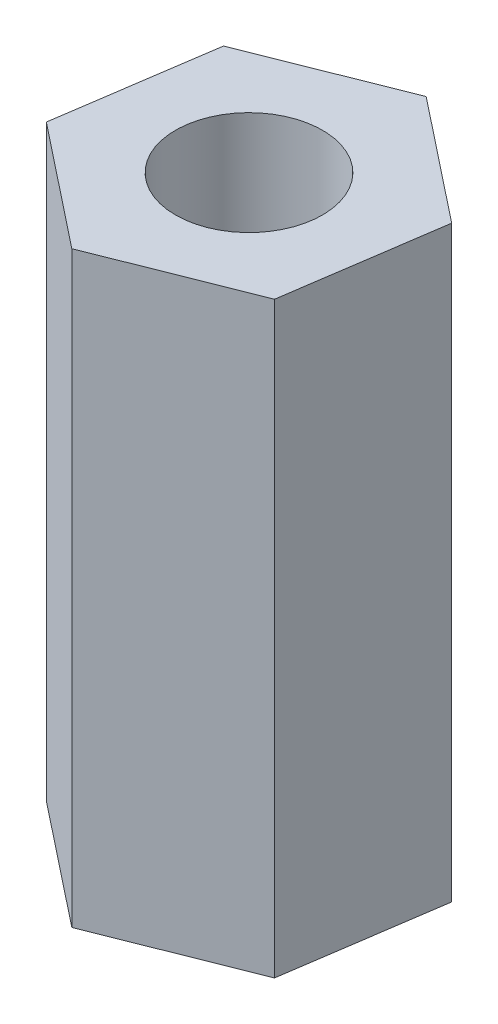
ISO-10303-21;
HEADER;
FILE_DESCRIPTION(('STEP AP214'),'2;1');
FILE_NAME('part.step','',(''),(''),'','','');
FILE_SCHEMA(('AUTOMOTIVE_DESIGN { 1 0 10303 214 1 1 1 1 }'));
ENDSEC;
DATA;
#1=APPLICATION_CONTEXT('core data for automotive mechanical design processes');
#2=APPLICATION_PROTOCOL_DEFINITION('international standard','automotive_design',2000,#1);
#3=PRODUCT_CONTEXT('',#1,'mechanical');
#4=PRODUCT('Part','Part','',(#3));
#5=PRODUCT_RELATED_PRODUCT_CATEGORY('part','',(#4));
#6=PRODUCT_DEFINITION_FORMATION('','',#4);
#7=PRODUCT_DEFINITION_CONTEXT('part definition',#1,'design');
#8=PRODUCT_DEFINITION('design','',#6,#7);
#9=PRODUCT_DEFINITION_SHAPE('','',#8);
#10=(LENGTH_UNIT() NAMED_UNIT(*) SI_UNIT(.MILLI.,.METRE.));
#11=(NAMED_UNIT(*) PLANE_ANGLE_UNIT() SI_UNIT($,.RADIAN.));
#12=(NAMED_UNIT(*) SI_UNIT($,.STERADIAN.) SOLID_ANGLE_UNIT());
#13=UNCERTAINTY_MEASURE_WITH_UNIT(LENGTH_MEASURE(1.E-05),#10,'distance_accuracy_value','');
#14=(GEOMETRIC_REPRESENTATION_CONTEXT(3) GLOBAL_UNCERTAINTY_ASSIGNED_CONTEXT((#13)) GLOBAL_UNIT_ASSIGNED_CONTEXT((#10,
#11,#12)) REPRESENTATION_CONTEXT('',''));
#15=CARTESIAN_POINT('',(0.,0.,0.));
#16=DIRECTION('',(0.,0.,1.));
#17=DIRECTION('',(1.,0.,0.));
#18=AXIS2_PLACEMENT_3D('',#15,#16,#17);
#19=CARTESIAN_POINT('',(-0.386477916077778,10.,2.62754032389945));
#20=DIRECTION('',(-0.368652129532225,0.,-0.929567430255254));
#21=DIRECTION('',(-0.929567430255254,0.,0.368652129532225));
#22=AXIS2_PLACEMENT_3D('',#19,#20,#21);
#23=PLANE('',#22);
#24=DIRECTION('',(0.929567430255254,0.,-0.368652129532225));
#25=VECTOR('',#24,1.);
#26=CARTESIAN_POINT('',(-0.386477916077778,0.,2.62754032389945));
#27=LINE('',#26,#25);
#28=CARTESIAN_POINT('',(-0.386477916077778,0.,2.62754032389945));
#29=VERTEX_POINT('',#28);
#30=CARTESIAN_POINT('',(2.08227771192603,0.,1.64846985527475));
#31=VERTEX_POINT('',#30);
#32=EDGE_CURVE('E116',#29,#31,#27,.T.);
#33=ORIENTED_EDGE('',*,*,#32,.T.);
#34=DIRECTION('',(0.,-1.,0.));
#35=VECTOR('',#34,1.);
#36=CARTESIAN_POINT('',(2.08227771192603,10.,1.64846985527475));
#37=LINE('',#36,#35);
#38=CARTESIAN_POINT('',(2.08227771192603,10.,1.64846985527475));
#39=VERTEX_POINT('',#38);
#40=EDGE_CURVE('E11',#39,#31,#37,.T.);
#41=ORIENTED_EDGE('',*,*,#40,.F.);
#42=DIRECTION('',(0.929567430255254,0.,-0.368652129532225));
#43=VECTOR('',#42,1.);
#44=CARTESIAN_POINT('',(-0.386477916077778,10.,2.62754032389945));
#45=LINE('',#44,#43);
#46=CARTESIAN_POINT('',(-0.386477916077778,10.,2.62754032389945));
#47=VERTEX_POINT('',#46);
#48=EDGE_CURVE('E127',#47,#39,#45,.T.);
#49=ORIENTED_EDGE('',*,*,#48,.F.);
#50=DIRECTION('',(0.,-1.,0.));
#51=VECTOR('',#50,1.);
#52=CARTESIAN_POINT('',(-0.386477916077778,10.,2.62754032389945));
#53=LINE('',#52,#51);
#54=EDGE_CURVE('E112',#47,#29,#53,.T.);
#55=ORIENTED_EDGE('',*,*,#54,.T.);
#56=EDGE_LOOP('',(#33,#41,#49,#55));
#57=FACE_BOUND('',#56,.T.);
#58=ADVANCED_FACE('F32',(#57),#23,.F.);
#59=CARTESIAN_POINT('',(2.08227771192603,10.,1.64846985527475));
#60=DIRECTION('',(-0.989355073897781,0.,-0.145521605793488));
#61=DIRECTION('',(-0.145521605793488,0.,0.989355073897781));
#62=AXIS2_PLACEMENT_3D('',#59,#60,#61);
#63=PLANE('',#62);
#64=DIRECTION('',(0.145521605793488,0.,-0.989355073897781));
#65=VECTOR('',#64,1.);
#66=CARTESIAN_POINT('',(2.08227771192603,0.,1.64846985527475));
#67=LINE('',#66,#65);
#68=CARTESIAN_POINT('',(2.46875562800381,0.,-0.9790704686247));
#69=VERTEX_POINT('',#68);
#70=EDGE_CURVE('E119',#31,#69,#67,.T.);
#71=ORIENTED_EDGE('',*,*,#70,.T.);
#72=DIRECTION('',(0.,-1.,0.));
#73=VECTOR('',#72,1.);
#74=CARTESIAN_POINT('',(2.46875562800381,10.,-0.9790704686247));
#75=LINE('',#74,#73);
#76=CARTESIAN_POINT('',(2.46875562800381,10.,-0.9790704686247));
#77=VERTEX_POINT('',#76);
#78=EDGE_CURVE('E40',#77,#69,#75,.T.);
#79=ORIENTED_EDGE('',*,*,#78,.F.);
#80=DIRECTION('',(0.145521605793488,0.,-0.989355073897781));
#81=VECTOR('',#80,1.);
#82=CARTESIAN_POINT('',(2.08227771192603,10.,1.64846985527475));
#83=LINE('',#82,#81);
#84=EDGE_CURVE('E85',#39,#77,#83,.T.);
#85=ORIENTED_EDGE('',*,*,#84,.F.);
#86=ORIENTED_EDGE('',*,*,#40,.T.);
#87=EDGE_LOOP('',(#71,#79,#85,#86));
#88=FACE_BOUND('',#87,.T.);
#89=ADVANCED_FACE('F152',(#88),#63,.F.);
#90=CARTESIAN_POINT('',(2.46875562800381,10.,-0.9790704686247));
#91=DIRECTION('',(-0.620702944365557,0.,0.784045824461765));
#92=DIRECTION('',(0.784045824461765,0.,0.620702944365557));
#93=AXIS2_PLACEMENT_3D('',#90,#91,#92);
#94=PLANE('',#93);
#95=DIRECTION('',(-0.784045824461765,0.,-0.620702944365557));
#96=VECTOR('',#95,1.);
#97=CARTESIAN_POINT('',(2.46875562800381,0.,-0.9790704686247));
#98=LINE('',#97,#96);
#99=CARTESIAN_POINT('',(0.386477916077779,0.,-2.62754032389945));
#100=VERTEX_POINT('',#99);
#101=EDGE_CURVE('E122',#69,#100,#98,.T.);
#102=ORIENTED_EDGE('',*,*,#101,.T.);
#103=DIRECTION('',(0.,-1.,0.));
#104=VECTOR('',#103,1.);
#105=CARTESIAN_POINT('',(0.386477916077779,10.,-2.62754032389945));
#106=LINE('',#105,#104);
#107=CARTESIAN_POINT('',(0.386477916077779,10.,-2.62754032389945));
#108=VERTEX_POINT('',#107);
#109=EDGE_CURVE('E107',#108,#100,#106,.T.);
#110=ORIENTED_EDGE('',*,*,#109,.F.);
#111=DIRECTION('',(-0.784045824461765,0.,-0.620702944365557));
#112=VECTOR('',#111,1.);
#113=CARTESIAN_POINT('',(2.46875562800381,10.,-0.9790704686247));
#114=LINE('',#113,#112);
#115=EDGE_CURVE('E98',#77,#108,#114,.T.);
#116=ORIENTED_EDGE('',*,*,#115,.F.);
#117=ORIENTED_EDGE('',*,*,#78,.T.);
#118=EDGE_LOOP('',(#102,#110,#116,#117));
#119=FACE_BOUND('',#118,.T.);
#120=ADVANCED_FACE('F133',(#119),#94,.F.);
#121=CARTESIAN_POINT('',(0.386477916077779,10.,-2.62754032389945));
#122=DIRECTION('',(0.368652129532225,0.,0.929567430255254));
#123=DIRECTION('',(0.929567430255254,0.,-0.368652129532225));
#124=AXIS2_PLACEMENT_3D('',#121,#122,#123);
#125=PLANE('',#124);
#126=DIRECTION('',(-0.929567430255254,0.,0.368652129532225));
#127=VECTOR('',#126,1.);
#128=CARTESIAN_POINT('',(0.386477916077779,0.,-2.62754032389945));
#129=LINE('',#128,#127);
#130=CARTESIAN_POINT('',(-2.08227771192603,0.,-1.64846985527475));
#131=VERTEX_POINT('',#130);
#132=EDGE_CURVE('E106',#100,#131,#129,.T.);
#133=ORIENTED_EDGE('',*,*,#132,.T.);
#134=DIRECTION('',(0.,-1.,0.));
#135=VECTOR('',#134,1.);
#136=CARTESIAN_POINT('',(-2.08227771192603,10.,-1.64846985527475));
#137=LINE('',#136,#135);
#138=CARTESIAN_POINT('',(-2.08227771192603,10.,-1.64846985527475));
#139=VERTEX_POINT('',#138);
#140=EDGE_CURVE('E103',#139,#131,#137,.T.);
#141=ORIENTED_EDGE('',*,*,#140,.F.);
#142=DIRECTION('',(-0.929567430255254,0.,0.368652129532225));
#143=VECTOR('',#142,1.);
#144=CARTESIAN_POINT('',(0.386477916077779,10.,-2.62754032389945));
#145=LINE('',#144,#143);
#146=EDGE_CURVE('E92',#108,#139,#145,.T.);
#147=ORIENTED_EDGE('',*,*,#146,.F.);
#148=ORIENTED_EDGE('',*,*,#109,.T.);
#149=EDGE_LOOP('',(#133,#141,#147,#148));
#150=FACE_BOUND('',#149,.T.);
#151=ADVANCED_FACE('F104',(#150),#125,.F.);
#152=CARTESIAN_POINT('',(-2.08227771192603,10.,-1.64846985527475));
#153=DIRECTION('',(0.989355073897781,0.,0.145521605793488));
#154=DIRECTION('',(0.145521605793488,0.,-0.989355073897782));
#155=AXIS2_PLACEMENT_3D('',#152,#153,#154);
#156=PLANE('',#155);
#157=DIRECTION('',(-0.145521605793488,0.,0.989355073897782));
#158=VECTOR('',#157,1.);
#159=CARTESIAN_POINT('',(-2.08227771192603,0.,-1.64846985527475));
#160=LINE('',#159,#158);
#161=CARTESIAN_POINT('',(-2.46875562800381,0.,0.9790704686247));
#162=VERTEX_POINT('',#161);
#163=EDGE_CURVE('E71',#131,#162,#160,.T.);
#164=ORIENTED_EDGE('',*,*,#163,.T.);
#165=DIRECTION('',(0.,-1.,0.));
#166=VECTOR('',#165,1.);
#167=CARTESIAN_POINT('',(-2.46875562800381,10.,0.9790704686247));
#168=LINE('',#167,#166);
#169=CARTESIAN_POINT('',(-2.46875562800381,10.,0.9790704686247));
#170=VERTEX_POINT('',#169);
#171=EDGE_CURVE('E108',#170,#162,#168,.T.);
#172=ORIENTED_EDGE('',*,*,#171,.F.);
#173=DIRECTION('',(-0.145521605793488,0.,0.989355073897782));
#174=VECTOR('',#173,1.);
#175=CARTESIAN_POINT('',(-2.08227771192603,10.,-1.64846985527475));
#176=LINE('',#175,#174);
#177=EDGE_CURVE('E96',#139,#170,#176,.T.);
#178=ORIENTED_EDGE('',*,*,#177,.F.);
#179=ORIENTED_EDGE('',*,*,#140,.T.);
#180=EDGE_LOOP('',(#164,#172,#178,#179));
#181=FACE_BOUND('',#180,.T.);
#182=ADVANCED_FACE('F110',(#181),#156,.F.);
#183=CARTESIAN_POINT('',(-2.46875562800381,10.,0.9790704686247));
#184=DIRECTION('',(0.620702944365556,0.,-0.784045824461765));
#185=DIRECTION('',(-0.784045824461765,0.,-0.620702944365556));
#186=AXIS2_PLACEMENT_3D('',#183,#184,#185);
#187=PLANE('',#186);
#188=DIRECTION('',(0.784045824461765,0.,0.620702944365556));
#189=VECTOR('',#188,1.);
#190=CARTESIAN_POINT('',(-2.46875562800381,0.,0.9790704686247));
#191=LINE('',#190,#189);
#192=EDGE_CURVE('E77',#162,#29,#191,.T.);
#193=ORIENTED_EDGE('',*,*,#192,.T.);
#194=ORIENTED_EDGE('',*,*,#54,.F.);
#195=DIRECTION('',(0.784045824461765,0.,0.620702944365556));
#196=VECTOR('',#195,1.);
#197=CARTESIAN_POINT('',(-2.46875562800381,10.,0.9790704686247));
#198=LINE('',#197,#196);
#199=EDGE_CURVE('E48',#170,#47,#198,.T.);
#200=ORIENTED_EDGE('',*,*,#199,.F.);
#201=ORIENTED_EDGE('',*,*,#171,.T.);
#202=EDGE_LOOP('',(#193,#194,#200,#201));
#203=FACE_BOUND('',#202,.T.);
#204=ADVANCED_FACE('F140',(#203),#187,.F.);
#205=CARTESIAN_POINT('',(0.,10.,0.));
#206=DIRECTION('',(0.,1.,0.));
#207=DIRECTION('',(0.,0.,1.));
#208=AXIS2_PLACEMENT_3D('',#205,#206,#207);
#209=PLANE('',#208);
#210=CARTESIAN_POINT('',(0.,10.,0.));
#211=DIRECTION('',(0.,1.,0.));
#212=DIRECTION('',(0.,0.,1.));
#213=AXIS2_PLACEMENT_3D('',#210,#211,#212);
#214=CIRCLE('',#213,1.25);
#215=CARTESIAN_POINT('',(0.,10.,1.25));
#216=VERTEX_POINT('',#215);
#217=EDGE_CURVE('E207',#216,#216,#214,.T.);
#218=ORIENTED_EDGE('',*,*,#217,.F.);
#219=EDGE_LOOP('',(#218));
#220=FACE_BOUND('',#219,.T.);
#221=ORIENTED_EDGE('',*,*,#48,.T.);
#222=ORIENTED_EDGE('',*,*,#84,.T.);
#223=ORIENTED_EDGE('',*,*,#115,.T.);
#224=ORIENTED_EDGE('',*,*,#146,.T.);
#225=ORIENTED_EDGE('',*,*,#177,.T.);
#226=ORIENTED_EDGE('',*,*,#199,.T.);
#227=EDGE_LOOP('',(#221,#222,#223,#224,#225,#226));
#228=FACE_BOUND('',#227,.T.);
#229=ADVANCED_FACE('F94',(#220,#228),#209,.T.);
#230=CARTESIAN_POINT('',(0.,0.,0.));
#231=DIRECTION('',(0.,1.,0.));
#232=DIRECTION('',(0.,0.,1.));
#233=AXIS2_PLACEMENT_3D('',#230,#231,#232);
#234=PLANE('',#233);
#235=CARTESIAN_POINT('',(0.,0.,0.));
#236=DIRECTION('',(0.,1.,0.));
#237=DIRECTION('',(0.,0.,1.));
#238=AXIS2_PLACEMENT_3D('',#235,#236,#237);
#239=CIRCLE('',#238,1.25);
#240=CARTESIAN_POINT('',(0.,0.,1.25));
#241=VERTEX_POINT('',#240);
#242=EDGE_CURVE('E120',#241,#241,#239,.T.);
#243=ORIENTED_EDGE('',*,*,#242,.T.);
#244=EDGE_LOOP('',(#243));
#245=FACE_BOUND('',#244,.T.);
#246=ORIENTED_EDGE('',*,*,#32,.F.);
#247=ORIENTED_EDGE('',*,*,#192,.F.);
#248=ORIENTED_EDGE('',*,*,#163,.F.);
#249=ORIENTED_EDGE('',*,*,#132,.F.);
#250=ORIENTED_EDGE('',*,*,#101,.F.);
#251=ORIENTED_EDGE('',*,*,#70,.F.);
#252=EDGE_LOOP('',(#246,#247,#248,#249,#250,#251));
#253=FACE_BOUND('',#252,.T.);
#254=ADVANCED_FACE('F136',(#245,#253),#234,.F.);
#255=CARTESIAN_POINT('',(0.,0.,0.));
#256=DIRECTION('',(0.,1.,0.));
#257=DIRECTION('',(0.,0.,1.));
#258=AXIS2_PLACEMENT_3D('',#255,#256,#257);
#259=CYLINDRICAL_SURFACE('',#258,1.25);
#260=ORIENTED_EDGE('',*,*,#242,.F.);
#261=EDGE_LOOP('',(#260));
#262=FACE_BOUND('',#261,.T.);
#263=ORIENTED_EDGE('',*,*,#217,.T.);
#264=EDGE_LOOP('',(#263));
#265=FACE_BOUND('',#264,.T.);
#266=ADVANCED_FACE('F189',(#262,#265),#259,.F.);
#267=CLOSED_SHELL('',(#58,#89,#120,#151,#182,#204,#229,#254,#266));
#268=MANIFOLD_SOLID_BREP('B2',#267);
#269=ADVANCED_BREP_SHAPE_REPRESENTATION('',(#18,#268),#14);
#270=SHAPE_DEFINITION_REPRESENTATION(#9,#269);
ENDSEC;
END-ISO-10303-21;
